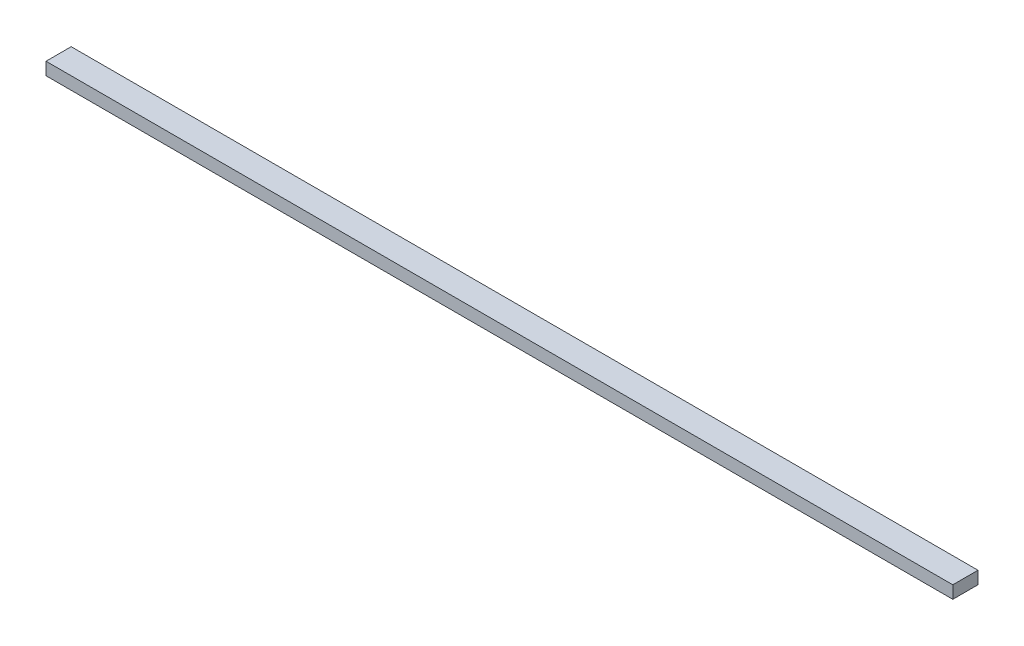
ISO-10303-21;
HEADER;
FILE_DESCRIPTION(('STEP AP214'),'2;1');
FILE_NAME('part.step','',(''),(''),'','','');
FILE_SCHEMA(('AUTOMOTIVE_DESIGN { 1 0 10303 214 1 1 1 1 }'));
ENDSEC;
DATA;
#1=APPLICATION_CONTEXT('core data for automotive mechanical design processes');
#2=APPLICATION_PROTOCOL_DEFINITION('international standard','automotive_design',2000,#1);
#3=PRODUCT_CONTEXT('',#1,'mechanical');
#4=PRODUCT('Part','Part','',(#3));
#5=PRODUCT_RELATED_PRODUCT_CATEGORY('part','',(#4));
#6=PRODUCT_DEFINITION_FORMATION('','',#4);
#7=PRODUCT_DEFINITION_CONTEXT('part definition',#1,'design');
#8=PRODUCT_DEFINITION('design','',#6,#7);
#9=PRODUCT_DEFINITION_SHAPE('','',#8);
#10=(LENGTH_UNIT() NAMED_UNIT(*) SI_UNIT(.MILLI.,.METRE.));
#11=(NAMED_UNIT(*) PLANE_ANGLE_UNIT() SI_UNIT($,.RADIAN.));
#12=(NAMED_UNIT(*) SI_UNIT($,.STERADIAN.) SOLID_ANGLE_UNIT());
#13=UNCERTAINTY_MEASURE_WITH_UNIT(LENGTH_MEASURE(1.E-05),#10,'distance_accuracy_value','');
#14=(GEOMETRIC_REPRESENTATION_CONTEXT(3) GLOBAL_UNCERTAINTY_ASSIGNED_CONTEXT((#13)) GLOBAL_UNIT_ASSIGNED_CONTEXT((#10,
#11,#12)) REPRESENTATION_CONTEXT('',''));
#15=CARTESIAN_POINT('',(0.,0.,0.));
#16=DIRECTION('',(0.,0.,1.));
#17=DIRECTION('',(1.,0.,0.));
#18=AXIS2_PLACEMENT_3D('',#15,#16,#17);
#19=CARTESIAN_POINT('',(0.,5.,10.));
#20=DIRECTION('',(1.,0.,0.));
#21=DIRECTION('',(0.,0.,-1.));
#22=AXIS2_PLACEMENT_3D('',#19,#20,#21);
#23=PLANE('',#22);
#24=DIRECTION('',(0.,0.,1.));
#25=VECTOR('',#24,1.);
#26=CARTESIAN_POINT('',(0.,0.,10.));
#27=LINE('',#26,#25);
#28=CARTESIAN_POINT('',(0.,0.,0.));
#29=VERTEX_POINT('',#28);
#30=CARTESIAN_POINT('',(0.,0.,10.));
#31=VERTEX_POINT('',#30);
#32=EDGE_CURVE('E98',#29,#31,#27,.T.);
#33=ORIENTED_EDGE('',*,*,#32,.T.);
#34=DIRECTION('',(0.,-1.,0.));
#35=VECTOR('',#34,1.);
#36=CARTESIAN_POINT('',(0.,5.,10.));
#37=LINE('',#36,#35);
#38=CARTESIAN_POINT('',(0.,5.,10.));
#39=VERTEX_POINT('',#38);
#40=EDGE_CURVE('E11',#39,#31,#37,.T.);
#41=ORIENTED_EDGE('',*,*,#40,.F.);
#42=DIRECTION('',(0.,0.,1.));
#43=VECTOR('',#42,1.);
#44=CARTESIAN_POINT('',(0.,5.,10.));
#45=LINE('',#44,#43);
#46=CARTESIAN_POINT('',(0.,5.,0.));
#47=VERTEX_POINT('',#46);
#48=EDGE_CURVE('E86',#47,#39,#45,.T.);
#49=ORIENTED_EDGE('',*,*,#48,.F.);
#50=DIRECTION('',(0.,-1.,0.));
#51=VECTOR('',#50,1.);
#52=CARTESIAN_POINT('',(0.,5.,0.));
#53=LINE('',#52,#51);
#54=EDGE_CURVE('E94',#47,#29,#53,.T.);
#55=ORIENTED_EDGE('',*,*,#54,.T.);
#56=EDGE_LOOP('',(#33,#41,#49,#55));
#57=FACE_BOUND('',#56,.T.);
#58=ADVANCED_FACE('F35',(#57),#23,.F.);
#59=CARTESIAN_POINT('',(359.9,5.,10.));
#60=DIRECTION('',(0.,0.,-1.));
#61=DIRECTION('',(-1.,0.,0.));
#62=AXIS2_PLACEMENT_3D('',#59,#60,#61);
#63=PLANE('',#62);
#64=DIRECTION('',(1.,0.,0.));
#65=VECTOR('',#64,1.);
#66=CARTESIAN_POINT('',(359.9,0.,10.));
#67=LINE('',#66,#65);
#68=CARTESIAN_POINT('',(359.9,0.,10.));
#69=VERTEX_POINT('',#68);
#70=EDGE_CURVE('E90',#31,#69,#67,.T.);
#71=ORIENTED_EDGE('',*,*,#70,.T.);
#72=DIRECTION('',(0.,-1.,0.));
#73=VECTOR('',#72,1.);
#74=CARTESIAN_POINT('',(359.9,5.,10.));
#75=LINE('',#74,#73);
#76=CARTESIAN_POINT('',(359.9,5.,10.));
#77=VERTEX_POINT('',#76);
#78=EDGE_CURVE('E43',#77,#69,#75,.T.);
#79=ORIENTED_EDGE('',*,*,#78,.F.);
#80=DIRECTION('',(1.,0.,0.));
#81=VECTOR('',#80,1.);
#82=CARTESIAN_POINT('',(359.9,5.,10.));
#83=LINE('',#82,#81);
#84=EDGE_CURVE('E81',#39,#77,#83,.T.);
#85=ORIENTED_EDGE('',*,*,#84,.F.);
#86=ORIENTED_EDGE('',*,*,#40,.T.);
#87=EDGE_LOOP('',(#71,#79,#85,#86));
#88=FACE_BOUND('',#87,.T.);
#89=ADVANCED_FACE('F89',(#88),#63,.F.);
#90=CARTESIAN_POINT('',(359.9,5.,0.));
#91=DIRECTION('',(-1.,0.,0.));
#92=DIRECTION('',(0.,0.,1.));
#93=AXIS2_PLACEMENT_3D('',#90,#91,#92);
#94=PLANE('',#93);
#95=DIRECTION('',(0.,0.,-1.));
#96=VECTOR('',#95,1.);
#97=CARTESIAN_POINT('',(359.9,0.,0.));
#98=LINE('',#97,#96);
#99=CARTESIAN_POINT('',(359.9,0.,0.));
#100=VERTEX_POINT('',#99);
#101=EDGE_CURVE('E68',#69,#100,#98,.T.);
#102=ORIENTED_EDGE('',*,*,#101,.T.);
#103=DIRECTION('',(0.,-1.,0.));
#104=VECTOR('',#103,1.);
#105=CARTESIAN_POINT('',(359.9,5.,0.));
#106=LINE('',#105,#104);
#107=CARTESIAN_POINT('',(359.9,5.,0.));
#108=VERTEX_POINT('',#107);
#109=EDGE_CURVE('E91',#108,#100,#106,.T.);
#110=ORIENTED_EDGE('',*,*,#109,.F.);
#111=DIRECTION('',(0.,0.,-1.));
#112=VECTOR('',#111,1.);
#113=CARTESIAN_POINT('',(359.9,5.,0.));
#114=LINE('',#113,#112);
#115=EDGE_CURVE('E84',#77,#108,#114,.T.);
#116=ORIENTED_EDGE('',*,*,#115,.F.);
#117=ORIENTED_EDGE('',*,*,#78,.T.);
#118=EDGE_LOOP('',(#102,#110,#116,#117));
#119=FACE_BOUND('',#118,.T.);
#120=ADVANCED_FACE('F92',(#119),#94,.F.);
#121=CARTESIAN_POINT('',(0.,5.,0.));
#122=DIRECTION('',(0.,0.,1.));
#123=DIRECTION('',(1.,0.,0.));
#124=AXIS2_PLACEMENT_3D('',#121,#122,#123);
#125=PLANE('',#124);
#126=DIRECTION('',(-1.,0.,0.));
#127=VECTOR('',#126,1.);
#128=CARTESIAN_POINT('',(0.,0.,0.));
#129=LINE('',#128,#127);
#130=EDGE_CURVE('E74',#100,#29,#129,.T.);
#131=ORIENTED_EDGE('',*,*,#130,.T.);
#132=ORIENTED_EDGE('',*,*,#54,.F.);
#133=DIRECTION('',(-1.,0.,0.));
#134=VECTOR('',#133,1.);
#135=CARTESIAN_POINT('',(0.,5.,0.));
#136=LINE('',#135,#134);
#137=EDGE_CURVE('E51',#108,#47,#136,.T.);
#138=ORIENTED_EDGE('',*,*,#137,.F.);
#139=ORIENTED_EDGE('',*,*,#109,.T.);
#140=EDGE_LOOP('',(#131,#132,#138,#139));
#141=FACE_BOUND('',#140,.T.);
#142=ADVANCED_FACE('F105',(#141),#125,.F.);
#143=CARTESIAN_POINT('',(0.,5.,0.));
#144=DIRECTION('',(0.,-1.,0.));
#145=DIRECTION('',(0.,0.,-1.));
#146=AXIS2_PLACEMENT_3D('',#143,#144,#145);
#147=PLANE('',#146);
#148=ORIENTED_EDGE('',*,*,#48,.T.);
#149=ORIENTED_EDGE('',*,*,#84,.T.);
#150=ORIENTED_EDGE('',*,*,#115,.T.);
#151=ORIENTED_EDGE('',*,*,#137,.T.);
#152=EDGE_LOOP('',(#148,#149,#150,#151));
#153=FACE_BOUND('',#152,.T.);
#154=ADVANCED_FACE('F82',(#153),#147,.F.);
#155=CARTESIAN_POINT('',(0.,0.,0.));
#156=DIRECTION('',(0.,-1.,0.));
#157=DIRECTION('',(0.,0.,-1.));
#158=AXIS2_PLACEMENT_3D('',#155,#156,#157);
#159=PLANE('',#158);
#160=ORIENTED_EDGE('',*,*,#32,.F.);
#161=ORIENTED_EDGE('',*,*,#130,.F.);
#162=ORIENTED_EDGE('',*,*,#101,.F.);
#163=ORIENTED_EDGE('',*,*,#70,.F.);
#164=EDGE_LOOP('',(#160,#161,#162,#163));
#165=FACE_BOUND('',#164,.T.);
#166=ADVANCED_FACE('F108',(#165),#159,.T.);
#167=CLOSED_SHELL('',(#58,#89,#120,#142,#154,#166));
#168=MANIFOLD_SOLID_BREP('B2',#167);
#169=ADVANCED_BREP_SHAPE_REPRESENTATION('',(#18,#168),#14);
#170=SHAPE_DEFINITION_REPRESENTATION(#9,#169);
ENDSEC;
END-ISO-10303-21;
